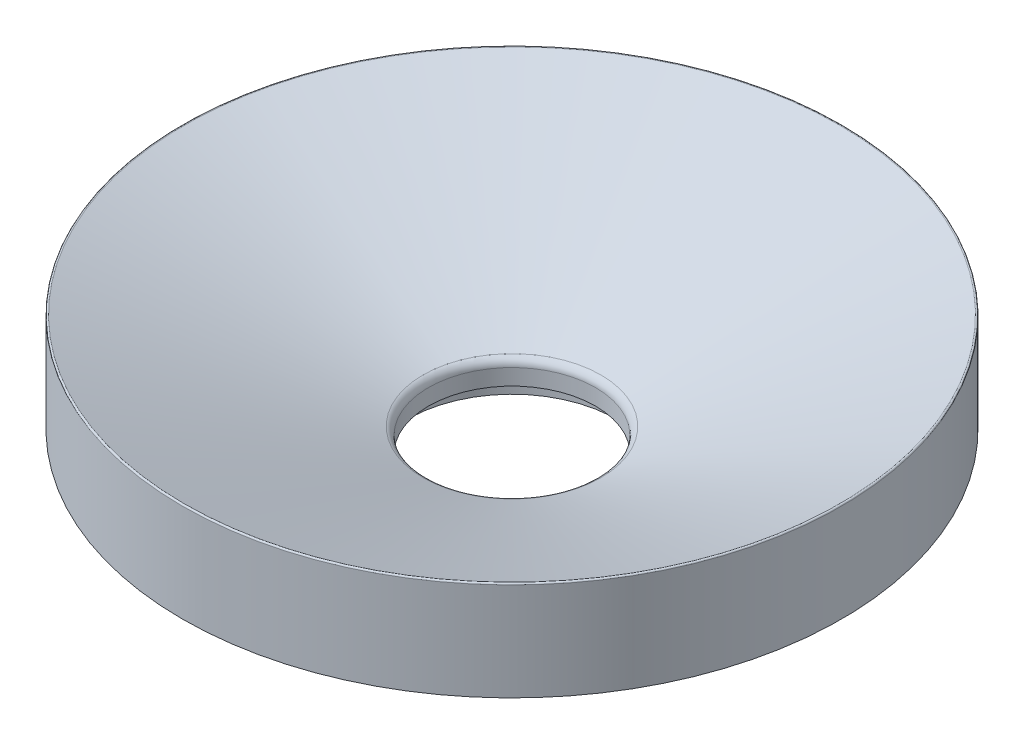
ISO-10303-21;
HEADER;
FILE_DESCRIPTION(('STEP AP214'),'2;1');
FILE_NAME('part.step','',(''),(''),'','','');
FILE_SCHEMA(('AUTOMOTIVE_DESIGN { 1 0 10303 214 1 1 1 1 }'));
ENDSEC;
DATA;
#1=APPLICATION_CONTEXT('core data for automotive mechanical design processes');
#2=APPLICATION_PROTOCOL_DEFINITION('international standard','automotive_design',2000,#1);
#3=PRODUCT_CONTEXT('',#1,'mechanical');
#4=PRODUCT('Part','Part','',(#3));
#5=PRODUCT_RELATED_PRODUCT_CATEGORY('part','',(#4));
#6=PRODUCT_DEFINITION_FORMATION('','',#4);
#7=PRODUCT_DEFINITION_CONTEXT('part definition',#1,'design');
#8=PRODUCT_DEFINITION('design','',#6,#7);
#9=PRODUCT_DEFINITION_SHAPE('','',#8);
#10=(LENGTH_UNIT() NAMED_UNIT(*) SI_UNIT(.MILLI.,.METRE.));
#11=(NAMED_UNIT(*) PLANE_ANGLE_UNIT() SI_UNIT($,.RADIAN.));
#12=(NAMED_UNIT(*) SI_UNIT($,.STERADIAN.) SOLID_ANGLE_UNIT());
#13=UNCERTAINTY_MEASURE_WITH_UNIT(LENGTH_MEASURE(1.E-05),#10,'distance_accuracy_value','');
#14=(GEOMETRIC_REPRESENTATION_CONTEXT(3) GLOBAL_UNCERTAINTY_ASSIGNED_CONTEXT((#13)) GLOBAL_UNIT_ASSIGNED_CONTEXT((#10,
#11,#12)) REPRESENTATION_CONTEXT('',''));
#15=CARTESIAN_POINT('',(0.,0.,0.));
#16=DIRECTION('',(0.,0.,1.));
#17=DIRECTION('',(1.,0.,0.));
#18=AXIS2_PLACEMENT_3D('',#15,#16,#17);
#19=CARTESIAN_POINT('',(0.,0.,0.));
#20=DIRECTION('',(0.,1.,0.));
#21=DIRECTION('',(0.,0.,1.));
#22=AXIS2_PLACEMENT_3D('',#19,#20,#21);
#23=PLANE('',#22);
#24=CARTESIAN_POINT('',(0.,0.,0.));
#25=DIRECTION('',(0.,1.,0.));
#26=DIRECTION('',(0.,0.,1.));
#27=AXIS2_PLACEMENT_3D('',#24,#25,#26);
#28=CIRCLE('',#27,17.653);
#29=CARTESIAN_POINT('',(0.,0.,17.653));
#30=VERTEX_POINT('',#29);
#31=EDGE_CURVE('E79',#30,#30,#28,.T.);
#32=ORIENTED_EDGE('',*,*,#31,.F.);
#33=EDGE_LOOP('',(#32));
#34=FACE_BOUND('',#33,.T.);
#35=CARTESIAN_POINT('',(0.,0.,0.));
#36=DIRECTION('',(0.,1.,0.));
#37=DIRECTION('',(0.,0.,1.));
#38=AXIS2_PLACEMENT_3D('',#35,#36,#37);
#39=CIRCLE('',#38,15.113);
#40=CARTESIAN_POINT('',(0.,0.,15.113));
#41=VERTEX_POINT('',#40);
#42=EDGE_CURVE('E83',#41,#41,#39,.T.);
#43=ORIENTED_EDGE('',*,*,#42,.T.);
#44=EDGE_LOOP('',(#43));
#45=FACE_BOUND('',#44,.T.);
#46=ADVANCED_FACE('F47',(#34,#45),#23,.F.);
#47=CARTESIAN_POINT('',(0.,3.175,0.));
#48=DIRECTION('',(0.,-1.,0.));
#49=DIRECTION('',(0.,0.,-1.));
#50=AXIS2_PLACEMENT_3D('',#47,#48,#49);
#51=CYLINDRICAL_SURFACE('',#50,17.653);
#52=CARTESIAN_POINT('',(0.,3.81,0.));
#53=DIRECTION('',(0.,1.,0.));
#54=DIRECTION('',(0.,0.,1.));
#55=AXIS2_PLACEMENT_3D('',#52,#53,#54);
#56=CIRCLE('',#55,17.653);
#57=CARTESIAN_POINT('',(0.,3.81,17.653));
#58=VERTEX_POINT('',#57);
#59=EDGE_CURVE('E71',#58,#58,#56,.F.);
#60=ORIENTED_EDGE('',*,*,#59,.T.);
#61=EDGE_LOOP('',(#60));
#62=FACE_BOUND('',#61,.T.);
#63=ORIENTED_EDGE('',*,*,#31,.T.);
#64=EDGE_LOOP('',(#63));
#65=FACE_BOUND('',#64,.T.);
#66=ADVANCED_FACE('F116',(#62,#65),#51,.T.);
#67=CARTESIAN_POINT('',(0.,3.175,0.));
#68=DIRECTION('',(0.,-1.,0.));
#69=DIRECTION('',(0.,0.,-1.));
#70=AXIS2_PLACEMENT_3D('',#67,#68,#69);
#71=CYLINDRICAL_SURFACE('',#70,15.113);
#72=CARTESIAN_POINT('',(0.,3.175,0.));
#73=DIRECTION('',(0.,1.,0.));
#74=DIRECTION('',(0.,0.,1.));
#75=AXIS2_PLACEMENT_3D('',#72,#73,#74);
#76=CIRCLE('',#75,15.113);
#77=CARTESIAN_POINT('',(0.,3.175,15.113));
#78=VERTEX_POINT('',#77);
#79=EDGE_CURVE('E87',#78,#78,#76,.T.);
#80=ORIENTED_EDGE('',*,*,#79,.T.);
#81=EDGE_LOOP('',(#80));
#82=FACE_BOUND('',#81,.T.);
#83=ORIENTED_EDGE('',*,*,#42,.F.);
#84=EDGE_LOOP('',(#83));
#85=FACE_BOUND('',#84,.T.);
#86=ADVANCED_FACE('F122',(#82,#85),#71,.F.);
#87=CARTESIAN_POINT('',(0.,3.175,0.));
#88=DIRECTION('',(0.,1.,0.));
#89=DIRECTION('',(0.,0.,1.));
#90=AXIS2_PLACEMENT_3D('',#87,#88,#89);
#91=PLANE('',#90);
#92=CARTESIAN_POINT('',(0.,3.175,0.));
#93=DIRECTION('',(0.,1.,0.));
#94=DIRECTION('',(0.,0.,1.));
#95=AXIS2_PLACEMENT_3D('',#92,#93,#94);
#96=CIRCLE('',#95,12.065);
#97=CARTESIAN_POINT('',(0.,3.175,12.065));
#98=VERTEX_POINT('',#97);
#99=EDGE_CURVE('E91',#98,#98,#96,.T.);
#100=ORIENTED_EDGE('',*,*,#99,.T.);
#101=EDGE_LOOP('',(#100));
#102=FACE_BOUND('',#101,.T.);
#103=ORIENTED_EDGE('',*,*,#79,.F.);
#104=EDGE_LOOP('',(#103));
#105=FACE_BOUND('',#104,.T.);
#106=ADVANCED_FACE('F148',(#102,#105),#91,.F.);
#107=CARTESIAN_POINT('',(0.,6.35,0.));
#108=DIRECTION('',(0.,-1.,0.));
#109=DIRECTION('',(0.,0.,-1.));
#110=AXIS2_PLACEMENT_3D('',#107,#108,#109);
#111=CYLINDRICAL_SURFACE('',#110,12.065);
#112=CARTESIAN_POINT('',(0.,5.49454493179811,0.));
#113=DIRECTION('',(0.,-1.,0.));
#114=DIRECTION('',(0.,0.,-1.));
#115=AXIS2_PLACEMENT_3D('',#112,#113,#114);
#116=CIRCLE('',#115,12.065);
#117=CARTESIAN_POINT('',(0.,5.49454493179811,-12.065));
#118=VERTEX_POINT('',#117);
#119=EDGE_CURVE('E65',#118,#118,#116,.F.);
#120=ORIENTED_EDGE('',*,*,#119,.T.);
#121=EDGE_LOOP('',(#120));
#122=FACE_BOUND('',#121,.T.);
#123=ORIENTED_EDGE('',*,*,#99,.F.);
#124=EDGE_LOOP('',(#123));
#125=FACE_BOUND('',#124,.T.);
#126=ADVANCED_FACE('F113',(#122,#125),#111,.F.);
#127=CARTESIAN_POINT('',(0.,20.76963842,0.));
#128=DIRECTION('',(0.,-1.,0.));
#129=DIRECTION('',(0.,0.,-1.));
#130=AXIS2_PLACEMENT_3D('',#127,#128,#129);
#131=CYLINDRICAL_SURFACE('',#130,47.625);
#132=CARTESIAN_POINT('',(0.,20.4868240338411,0.));
#133=DIRECTION('',(0.,-1.,0.));
#134=DIRECTION('',(0.,0.,-1.));
#135=AXIS2_PLACEMENT_3D('',#132,#133,#134);
#136=CIRCLE('',#135,47.625);
#137=CARTESIAN_POINT('',(0.,20.4868240338411,-47.625));
#138=VERTEX_POINT('',#137);
#139=EDGE_CURVE('E11',#138,#138,#136,.T.);
#140=ORIENTED_EDGE('',*,*,#139,.T.);
#141=EDGE_LOOP('',(#140));
#142=FACE_BOUND('',#141,.T.);
#143=CARTESIAN_POINT('',(0.,6.35,0.));
#144=DIRECTION('',(0.,1.,0.));
#145=DIRECTION('',(0.,0.,1.));
#146=AXIS2_PLACEMENT_3D('',#143,#144,#145);
#147=CIRCLE('',#146,47.625);
#148=CARTESIAN_POINT('',(0.,6.35,47.625));
#149=VERTEX_POINT('',#148);
#150=EDGE_CURVE('E95',#149,#149,#147,.T.);
#151=ORIENTED_EDGE('',*,*,#150,.T.);
#152=EDGE_LOOP('',(#151));
#153=FACE_BOUND('',#152,.T.);
#154=ADVANCED_FACE('F100',(#142,#153),#131,.T.);
#155=CARTESIAN_POINT('',(0.,6.35,0.));
#156=DIRECTION('',(0.,1.,0.));
#157=DIRECTION('',(0.,0.,1.));
#158=AXIS2_PLACEMENT_3D('',#155,#156,#157);
#159=PLANE('',#158);
#160=CARTESIAN_POINT('',(0.,6.35,0.));
#161=DIRECTION('',(0.,1.,0.));
#162=DIRECTION('',(0.,0.,1.));
#163=AXIS2_PLACEMENT_3D('',#160,#161,#162);
#164=CIRCLE('',#163,27.1324090512252);
#165=CARTESIAN_POINT('',(0.,6.35,27.1324090512252));
#166=VERTEX_POINT('',#165);
#167=EDGE_CURVE('E75',#166,#166,#164,.T.);
#168=ORIENTED_EDGE('',*,*,#167,.T.);
#169=EDGE_LOOP('',(#168));
#170=FACE_BOUND('',#169,.T.);
#171=ORIENTED_EDGE('',*,*,#150,.F.);
#172=EDGE_LOOP('',(#171));
#173=FACE_BOUND('',#172,.T.);
#174=ADVANCED_FACE('F102',(#170,#173),#159,.F.);
#175=CARTESIAN_POINT('',(0.,6.35,0.));
#176=DIRECTION('',(0.,1.,0.));
#177=DIRECTION('',(0.,0.,1.));
#178=AXIS2_PLACEMENT_3D('',#175,#176,#177);
#179=CONICAL_SURFACE('',#178,12.065,1.18555617008222);
#180=CARTESIAN_POINT('',(0.,20.6633619483985,0.));
#181=DIRECTION('',(0.,-1.,0.));
#182=DIRECTION('',(0.,0.,-1.));
#183=AXIS2_PLACEMENT_3D('',#180,#181,#182);
#184=CIRCLE('',#183,47.3629135856204);
#185=CARTESIAN_POINT('',(0.,20.6633619483985,47.3629135856204));
#186=VERTEX_POINT('',#185);
#187=EDGE_CURVE('E55',#186,#186,#184,.F.);
#188=CARTESIAN_POINT('',(0.,6.67146436218071,0.));
#189=DIRECTION('',(0.,1.,0.));
#190=DIRECTION('',(0.,0.,1.));
#191=AXIS2_PLACEMENT_3D('',#188,#189,#190);
#192=CIRCLE('',#191,12.8577572374694);
#193=CARTESIAN_POINT('',(0.,6.67146436218071,12.8577572374693));
#194=VERTEX_POINT('',#193);
#195=EDGE_CURVE('E60',#194,#194,#192,.F.);
#196=CARTESIAN_POINT('',(0.,20.6633619483985,47.3629135856204));
#197=CARTESIAN_POINT('',(0.,20.5176130152088,47.0034848736605));
#198=CARTESIAN_POINT('',(0.,20.371864082019,46.6440561617006));
#199=CARTESIAN_POINT('',(0.,20.0803662156395,45.9251987377808));
#200=CARTESIAN_POINT('',(0.,19.9346172824497,45.5657700258209));
#201=CARTESIAN_POINT('',(0.,19.6431194160701,44.8469126019011));
#202=CARTESIAN_POINT('',(0.,19.4973704828804,44.4874838899412));
#203=CARTESIAN_POINT('',(0.,19.2058726165008,43.7686264660213));
#204=CARTESIAN_POINT('',(0.,19.0601236833111,43.4091977540614));
#205=CARTESIAN_POINT('',(0.,18.7686258169315,42.6903403301416));
#206=CARTESIAN_POINT('',(0.,18.6228768837418,42.3309116181817));
#207=CARTESIAN_POINT('',(0.,18.3313790173622,41.6120541942619));
#208=CARTESIAN_POINT('',(0.,18.1856300841725,41.252625482302));
#209=CARTESIAN_POINT('',(0.,17.8941322177929,40.5337680583822));
#210=CARTESIAN_POINT('',(0.,17.7483832846032,40.1743393464223));
#211=CARTESIAN_POINT('',(0.,17.4568854182236,39.4554819225025));
#212=CARTESIAN_POINT('',(0.,17.3111364850339,39.0960532105426));
#213=CARTESIAN_POINT('',(0.,17.0196386186543,38.3771957866227));
#214=CARTESIAN_POINT('',(0.,16.8738896854645,38.0177670746628));
#215=CARTESIAN_POINT('',(0.,16.582391819085,37.298909650743));
#216=CARTESIAN_POINT('',(0.,16.4366428858952,36.9394809387831));
#217=CARTESIAN_POINT('',(0.,16.1451450195157,36.2206235148633));
#218=CARTESIAN_POINT('',(0.,15.9993960863259,35.8611948029034));
#219=CARTESIAN_POINT('',(0.,15.7078982199464,35.1423373789836));
#220=CARTESIAN_POINT('',(0.,15.5621492867566,34.7829086670237));
#221=CARTESIAN_POINT('',(0.,15.2706514203771,34.0640512431039));
#222=CARTESIAN_POINT('',(0.,15.1249024871873,33.7046225311439));
#223=CARTESIAN_POINT('',(0.,14.8334046208078,32.9857651072241));
#224=CARTESIAN_POINT('',(0.,14.687655687618,32.6263363952642));
#225=CARTESIAN_POINT('',(0.,14.3961578212385,31.9074789713444));
#226=CARTESIAN_POINT('',(0.,14.2504088880487,31.5480502593845));
#227=CARTESIAN_POINT('',(0.,13.9589110216692,30.8291928354647));
#228=CARTESIAN_POINT('',(0.,13.8131620884794,30.4697641235048));
#229=CARTESIAN_POINT('',(0.,13.5216642220999,29.750906699585));
#230=CARTESIAN_POINT('',(0.,13.3759152889101,29.3914779876251));
#231=CARTESIAN_POINT('',(0.,13.0844174225305,28.6726205637053));
#232=CARTESIAN_POINT('',(0.,12.9386684893408,28.3131918517453));
#233=CARTESIAN_POINT('',(0.,12.6471706229612,27.5943344278255));
#234=CARTESIAN_POINT('',(0.,12.5014216897715,27.2349057158656));
#235=CARTESIAN_POINT('',(0.,12.2099238233919,26.5160482919458));
#236=CARTESIAN_POINT('',(0.,12.0641748902022,26.1566195799859));
#237=CARTESIAN_POINT('',(0.,11.7726770238226,25.4377621560661));
#238=CARTESIAN_POINT('',(0.,11.6269280906329,25.0783334441062));
#239=CARTESIAN_POINT('',(0.,11.3354302242533,24.3594760201864));
#240=CARTESIAN_POINT('',(0.,11.1896812910636,24.0000473082265));
#241=CARTESIAN_POINT('',(0.,10.898183424684,23.2811898843066));
#242=CARTESIAN_POINT('',(0.,10.7524344914942,22.9217611723467));
#243=CARTESIAN_POINT('',(0.,10.4609366251147,22.2029037484269));
#244=CARTESIAN_POINT('',(0.,10.3151876919249,21.843475036467));
#245=CARTESIAN_POINT('',(0.,10.0236898255454,21.1246176125472));
#246=CARTESIAN_POINT('',(0.,9.87794089235563,20.7651889005873));
#247=CARTESIAN_POINT('',(0.,9.58644302597609,20.0463314766675));
#248=CARTESIAN_POINT('',(0.,9.44069409278632,19.6869027647076));
#249=CARTESIAN_POINT('',(0.,9.14919622640678,18.9680453407878));
#250=CARTESIAN_POINT('',(0.,9.00344729321702,18.6086166288279));
#251=CARTESIAN_POINT('',(0.,8.71194942683748,17.889759204908));
#252=CARTESIAN_POINT('',(0.,8.56620049364771,17.5303304929481));
#253=CARTESIAN_POINT('',(0.,8.27470262726817,16.8114730690283));
#254=CARTESIAN_POINT('',(0.,8.1289536940784,16.4520443570684));
#255=CARTESIAN_POINT('',(0.,7.83745582769886,15.7331869331486));
#256=CARTESIAN_POINT('',(0.,7.69170689450909,15.3737582211887));
#257=CARTESIAN_POINT('',(0.,7.40020902812956,14.6549007972689));
#258=CARTESIAN_POINT('',(0.,7.25446009493979,14.295472085309));
#259=CARTESIAN_POINT('',(0.,6.96296222856025,13.5766146613892));
#260=CARTESIAN_POINT('',(0.,6.81721329537048,13.2171859494293));
#261=CARTESIAN_POINT('',(0.,6.67146436218071,12.8577572374693));
#262=B_SPLINE_CURVE_WITH_KNOTS('',3,(#196,#197,#198,#199,#200,#201,#202,#203,#204,#205,#206,
#207,#208,#209,#210,#211,#212,#213,#214,#215,#216,#217,#218,#219,#220,#221,#222,#223,#224,#225,
#226,#227,#228,#229,#230,#231,#232,#233,#234,#235,#236,#237,#238,#239,#240,#241,#242,#243,#244,
#245,#246,#247,#248,#249,#250,#251,#252,#253,#254,#255,#256,#257,#258,#259,#260,#261),
.UNSPECIFIED.,.F.,.F.,(4,2,2,2,2,2,2,2,2,2,2,2,2,2,2,2,2,2,2,2,2,2,2,2,2,2,2,2,2,2,2,2,4),(0.,
1.16356596485288,2.32713192970576,3.49069789455865,4.65426385941153,5.81782982426442,
6.9813957891173,8.14496175397018,9.30852771882306,10.4720936836759,11.6356596485288,
12.7992256133817,13.9627915782346,15.1263575430875,16.2899235079404,17.4534894727932,
18.6170554376461,19.780621402499,20.9441873673519,22.1077533322048,23.2713192970577,
24.4348852619105,25.5984512267634,26.7620171916163,27.9255831564692,29.0891491213221,
30.2527150861749,31.4162810510278,32.5798470158807,33.7434129807336,34.9069789455865,
36.0705449104394,37.2341108752923),.UNSPECIFIED.);
#263=EDGE_CURVE('BSEAM104',#186,#194,#262,.T.);
#264=ORIENTED_EDGE('',*,*,#187,.T.);
#265=ORIENTED_EDGE('',*,*,#195,.T.);
#266=ORIENTED_EDGE('',*,*,#263,.T.);
#267=ORIENTED_EDGE('',*,*,#263,.F.);
#268=EDGE_LOOP('',(#264,#266,#265,#267));
#269=FACE_BOUND('',#268,.T.);
#270=ADVANCED_FACE('F104',(#269),#179,.F.);
#271=CARTESIAN_POINT('',(0.,6.35,0.));
#272=DIRECTION('',(0.,1.,0.));
#273=DIRECTION('',(0.,0.,1.));
#274=AXIS2_PLACEMENT_3D('',#271,#272,#273);
#275=CONICAL_SURFACE('',#274,27.1324090512252,1.30899693899575);
#276=ORIENTED_EDGE('',*,*,#59,.F.);
#277=EDGE_LOOP('',(#276));
#278=FACE_BOUND('',#277,.T.);
#279=ORIENTED_EDGE('',*,*,#167,.F.);
#280=EDGE_LOOP('',(#279));
#281=FACE_BOUND('',#280,.T.);
#282=ADVANCED_FACE('F111',(#278,#281),#275,.T.);
#283=CARTESIAN_POINT('',(0.,5.49454493179811,0.));
#284=DIRECTION('',(0.,-1.,0.));
#285=DIRECTION('',(0.,0.,-1.));
#286=AXIS2_PLACEMENT_3D('',#283,#284,#285);
#287=TOROIDAL_SURFACE('',#286,13.335,1.27);
#288=ORIENTED_EDGE('',*,*,#195,.F.);
#289=EDGE_LOOP('',(#288));
#290=FACE_BOUND('',#289,.T.);
#291=ORIENTED_EDGE('',*,*,#119,.F.);
#292=EDGE_LOOP('',(#291));
#293=FACE_BOUND('',#292,.T.);
#294=ADVANCED_FACE('F134',(#290,#293),#287,.T.);
#295=CARTESIAN_POINT('',(0.,20.4868240338411,0.));
#296=DIRECTION('',(0.,-1.,0.));
#297=DIRECTION('',(0.,0.,-1.));
#298=AXIS2_PLACEMENT_3D('',#295,#296,#297);
#299=TOROIDAL_SURFACE('',#298,47.4345,0.1905);
#300=ORIENTED_EDGE('',*,*,#139,.F.);
#301=EDGE_LOOP('',(#300));
#302=FACE_BOUND('',#301,.T.);
#303=ORIENTED_EDGE('',*,*,#187,.F.);
#304=EDGE_LOOP('',(#303));
#305=FACE_BOUND('',#304,.T.);
#306=ADVANCED_FACE('F49',(#302,#305),#299,.T.);
#307=CLOSED_SHELL('',(#46,#66,#86,#106,#126,#154,#174,#270,#282,#294,#306));
#308=MANIFOLD_SOLID_BREP('B2',#307);
#309=ADVANCED_BREP_SHAPE_REPRESENTATION('',(#18,#308),#14);
#310=SHAPE_DEFINITION_REPRESENTATION(#9,#309);
ENDSEC;
END-ISO-10303-21;
